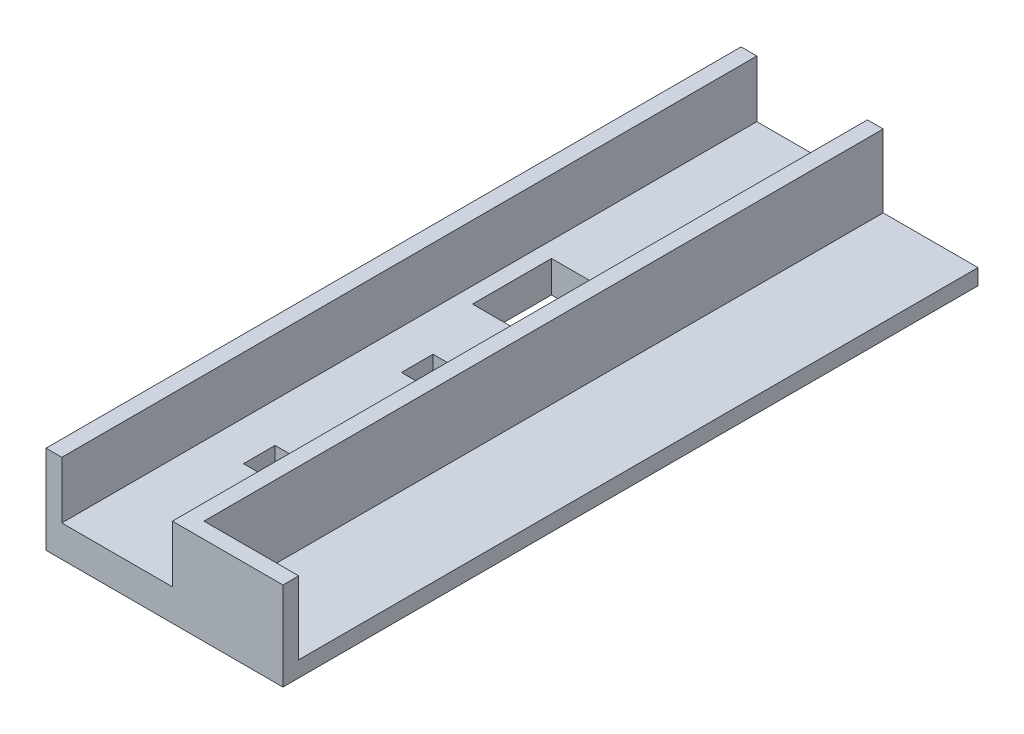
ISO-10303-21;
HEADER;
FILE_DESCRIPTION(('STEP AP214'),'2;1');
FILE_NAME('part.step','',(''),(''),'','','');
FILE_SCHEMA(('AUTOMOTIVE_DESIGN { 1 0 10303 214 1 1 1 1 }'));
ENDSEC;
DATA;
#1=APPLICATION_CONTEXT('core data for automotive mechanical design processes');
#2=APPLICATION_PROTOCOL_DEFINITION('international standard','automotive_design',2000,#1);
#3=PRODUCT_CONTEXT('',#1,'mechanical');
#4=PRODUCT('Part','Part','',(#3));
#5=PRODUCT_RELATED_PRODUCT_CATEGORY('part','',(#4));
#6=PRODUCT_DEFINITION_FORMATION('','',#4);
#7=PRODUCT_DEFINITION_CONTEXT('part definition',#1,'design');
#8=PRODUCT_DEFINITION('design','',#6,#7);
#9=PRODUCT_DEFINITION_SHAPE('','',#8);
#10=(LENGTH_UNIT() NAMED_UNIT(*) SI_UNIT(.MILLI.,.METRE.));
#11=(NAMED_UNIT(*) PLANE_ANGLE_UNIT() SI_UNIT($,.RADIAN.));
#12=(NAMED_UNIT(*) SI_UNIT($,.STERADIAN.) SOLID_ANGLE_UNIT());
#13=UNCERTAINTY_MEASURE_WITH_UNIT(LENGTH_MEASURE(1.E-05),#10,'distance_accuracy_value','');
#14=(GEOMETRIC_REPRESENTATION_CONTEXT(3) GLOBAL_UNCERTAINTY_ASSIGNED_CONTEXT((#13)) GLOBAL_UNIT_ASSIGNED_CONTEXT((#10,
#11,#12)) REPRESENTATION_CONTEXT('',''));
#15=CARTESIAN_POINT('',(0.,0.,0.));
#16=DIRECTION('',(0.,0.,1.));
#17=DIRECTION('',(1.,0.,0.));
#18=AXIS2_PLACEMENT_3D('',#15,#16,#17);
#19=CARTESIAN_POINT('',(0.,-10.,-220.));
#20=DIRECTION('',(0.,-1.,0.));
#21=DIRECTION('',(0.,0.,-1.));
#22=AXIS2_PLACEMENT_3D('',#19,#20,#21);
#23=PLANE('',#22);
#24=DIRECTION('',(0.,0.,-1.));
#25=VECTOR('',#24,1.);
#26=CARTESIAN_POINT('',(-4.99999999999996,-10.,-220.));
#27=LINE('',#26,#25);
#28=CARTESIAN_POINT('',(-4.99999999999999,-10.,-45.));
#29=VERTEX_POINT('',#28);
#30=CARTESIAN_POINT('',(-4.99999999999999,-10.,-55.));
#31=VERTEX_POINT('',#30);
#32=EDGE_CURVE('E287',#29,#31,#27,.T.);
#33=ORIENTED_EDGE('',*,*,#32,.F.);
#34=DIRECTION('',(-1.,0.,0.));
#35=VECTOR('',#34,1.);
#36=CARTESIAN_POINT('',(0.,-10.,-45.));
#37=LINE('',#36,#35);
#38=CARTESIAN_POINT('',(5.00000000000001,-10.,-45.));
#39=VERTEX_POINT('',#38);
#40=EDGE_CURVE('E282',#39,#29,#37,.T.);
#41=ORIENTED_EDGE('',*,*,#40,.F.);
#42=DIRECTION('',(0.,0.,1.));
#43=VECTOR('',#42,1.);
#44=CARTESIAN_POINT('',(5.00000000000004,-10.,-220.));
#45=LINE('',#44,#43);
#46=CARTESIAN_POINT('',(5.00000000000001,-10.,-55.));
#47=VERTEX_POINT('',#46);
#48=EDGE_CURVE('E201',#47,#39,#45,.T.);
#49=ORIENTED_EDGE('',*,*,#48,.F.);
#50=DIRECTION('',(1.,0.,0.));
#51=VECTOR('',#50,1.);
#52=CARTESIAN_POINT('',(0.,-10.,-55.));
#53=LINE('',#52,#51);
#54=EDGE_CURVE('E285',#31,#47,#53,.T.);
#55=ORIENTED_EDGE('',*,*,#54,.F.);
#56=EDGE_LOOP('',(#33,#41,#49,#55));
#57=FACE_BOUND('',#56,.T.);
#58=DIRECTION('',(0.,0.,-1.));
#59=VECTOR('',#58,1.);
#60=CARTESIAN_POINT('',(-5.00000000000002,-10.,-220.));
#61=LINE('',#60,#59);
#62=CARTESIAN_POINT('',(-5.00000000000002,-10.,-95.));
#63=VERTEX_POINT('',#62);
#64=CARTESIAN_POINT('',(-5.00000000000002,-10.,-105.));
#65=VERTEX_POINT('',#64);
#66=EDGE_CURVE('E280',#63,#65,#61,.T.);
#67=ORIENTED_EDGE('',*,*,#66,.F.);
#68=DIRECTION('',(-1.,0.,0.));
#69=VECTOR('',#68,1.);
#70=CARTESIAN_POINT('',(0.,-10.,-95.));
#71=LINE('',#70,#69);
#72=CARTESIAN_POINT('',(4.99999999999998,-10.,-95.));
#73=VERTEX_POINT('',#72);
#74=EDGE_CURVE('E274',#73,#63,#71,.T.);
#75=ORIENTED_EDGE('',*,*,#74,.F.);
#76=DIRECTION('',(0.,0.,1.));
#77=VECTOR('',#76,1.);
#78=CARTESIAN_POINT('',(4.99999999999998,-10.,-220.));
#79=LINE('',#78,#77);
#80=CARTESIAN_POINT('',(4.99999999999998,-10.,-105.));
#81=VERTEX_POINT('',#80);
#82=EDGE_CURVE('E276',#81,#73,#79,.T.);
#83=ORIENTED_EDGE('',*,*,#82,.F.);
#84=DIRECTION('',(1.,0.,0.));
#85=VECTOR('',#84,1.);
#86=CARTESIAN_POINT('',(0.,-10.,-105.));
#87=LINE('',#86,#85);
#88=EDGE_CURVE('E278',#65,#81,#87,.T.);
#89=ORIENTED_EDGE('',*,*,#88,.F.);
#90=EDGE_LOOP('',(#67,#75,#83,#89));
#91=FACE_BOUND('',#90,.T.);
#92=DIRECTION('',(0.,0.,-1.));
#93=VECTOR('',#92,1.);
#94=CARTESIAN_POINT('',(-12.5,-10.,-220.));
#95=LINE('',#94,#93);
#96=CARTESIAN_POINT('',(-12.5,-10.,-125.));
#97=VERTEX_POINT('',#96);
#98=CARTESIAN_POINT('',(-12.5,-10.,-150.));
#99=VERTEX_POINT('',#98);
#100=EDGE_CURVE('E272',#97,#99,#95,.T.);
#101=ORIENTED_EDGE('',*,*,#100,.F.);
#102=DIRECTION('',(-1.,0.,0.));
#103=VECTOR('',#102,1.);
#104=CARTESIAN_POINT('',(0.,-10.,-125.));
#105=LINE('',#104,#103);
#106=CARTESIAN_POINT('',(12.5,-10.,-125.));
#107=VERTEX_POINT('',#106);
#108=EDGE_CURVE('E225',#107,#97,#105,.T.);
#109=ORIENTED_EDGE('',*,*,#108,.F.);
#110=DIRECTION('',(0.,0.,1.));
#111=VECTOR('',#110,1.);
#112=CARTESIAN_POINT('',(12.5,-10.,-220.));
#113=LINE('',#112,#111);
#114=CARTESIAN_POINT('',(12.5,-10.,-150.));
#115=VERTEX_POINT('',#114);
#116=EDGE_CURVE('E267',#115,#107,#113,.T.);
#117=ORIENTED_EDGE('',*,*,#116,.F.);
#118=DIRECTION('',(1.,0.,0.));
#119=VECTOR('',#118,1.);
#120=CARTESIAN_POINT('',(0.,-10.,-150.));
#121=LINE('',#120,#119);
#122=EDGE_CURVE('E270',#99,#115,#121,.T.);
#123=ORIENTED_EDGE('',*,*,#122,.F.);
#124=EDGE_LOOP('',(#101,#109,#117,#123));
#125=FACE_BOUND('',#124,.T.);
#126=DIRECTION('',(1.,0.,0.));
#127=VECTOR('',#126,1.);
#128=CARTESIAN_POINT('',(0.,-10.,0.));
#129=LINE('',#128,#127);
#130=CARTESIAN_POINT('',(-22.5,-10.,0.));
#131=VERTEX_POINT('',#130);
#132=CARTESIAN_POINT('',(52.5,-10.,0.));
#133=VERTEX_POINT('',#132);
#134=EDGE_CURVE('E304',#131,#133,#129,.T.);
#135=ORIENTED_EDGE('',*,*,#134,.F.);
#136=DIRECTION('',(0.,0.,1.));
#137=VECTOR('',#136,1.);
#138=CARTESIAN_POINT('',(-22.5,-10.,-220.));
#139=LINE('',#138,#137);
#140=CARTESIAN_POINT('',(-22.5,-10.,-220.));
#141=VERTEX_POINT('',#140);
#142=EDGE_CURVE('E11',#141,#131,#139,.T.);
#143=ORIENTED_EDGE('',*,*,#142,.F.);
#144=DIRECTION('',(1.,0.,0.));
#145=VECTOR('',#144,1.);
#146=CARTESIAN_POINT('',(0.,-10.,-220.));
#147=LINE('',#146,#145);
#148=CARTESIAN_POINT('',(52.5,-10.,-220.));
#149=VERTEX_POINT('',#148);
#150=EDGE_CURVE('E305',#141,#149,#147,.T.);
#151=ORIENTED_EDGE('',*,*,#150,.T.);
#152=DIRECTION('',(0.,0.,1.));
#153=VECTOR('',#152,1.);
#154=CARTESIAN_POINT('',(52.5,-10.,-220.));
#155=LINE('',#154,#153);
#156=EDGE_CURVE('E44',#149,#133,#155,.T.);
#157=ORIENTED_EDGE('',*,*,#156,.T.);
#158=EDGE_LOOP('',(#135,#143,#151,#157));
#159=FACE_BOUND('',#158,.T.);
#160=ADVANCED_FACE('F41',(#57,#91,#125,#159),#23,.T.);
#161=CARTESIAN_POINT('',(-22.5,0.,-220.));
#162=DIRECTION('',(-1.,0.,0.));
#163=DIRECTION('',(0.,-1.,0.));
#164=AXIS2_PLACEMENT_3D('',#161,#162,#163);
#165=PLANE('',#164);
#166=DIRECTION('',(0.,-1.,0.));
#167=VECTOR('',#166,1.);
#168=CARTESIAN_POINT('',(-22.5,0.,0.));
#169=LINE('',#168,#167);
#170=CARTESIAN_POINT('',(-22.5,18.,0.));
#171=VERTEX_POINT('',#170);
#172=EDGE_CURVE('E309',#171,#131,#169,.T.);
#173=ORIENTED_EDGE('',*,*,#172,.F.);
#174=DIRECTION('',(0.,0.,1.));
#175=VECTOR('',#174,1.);
#176=CARTESIAN_POINT('',(-22.5,18.,-220.));
#177=LINE('',#176,#175);
#178=CARTESIAN_POINT('',(-22.5,18.,-220.));
#179=VERTEX_POINT('',#178);
#180=EDGE_CURVE('E49',#179,#171,#177,.T.);
#181=ORIENTED_EDGE('',*,*,#180,.F.);
#182=DIRECTION('',(0.,-1.,0.));
#183=VECTOR('',#182,1.);
#184=CARTESIAN_POINT('',(-22.5,0.,-220.));
#185=LINE('',#184,#183);
#186=EDGE_CURVE('E331',#179,#141,#185,.T.);
#187=ORIENTED_EDGE('',*,*,#186,.T.);
#188=ORIENTED_EDGE('',*,*,#142,.T.);
#189=EDGE_LOOP('',(#173,#181,#187,#188));
#190=FACE_BOUND('',#189,.T.);
#191=ADVANCED_FACE('F385',(#190),#165,.T.);
#192=CARTESIAN_POINT('',(0.,18.,-220.));
#193=DIRECTION('',(0.,1.,0.));
#194=DIRECTION('',(-1.,0.,0.));
#195=AXIS2_PLACEMENT_3D('',#192,#193,#194);
#196=PLANE('',#195);
#197=DIRECTION('',(-1.,0.,0.));
#198=VECTOR('',#197,1.);
#199=CARTESIAN_POINT('',(0.,18.,0.));
#200=LINE('',#199,#198);
#201=CARTESIAN_POINT('',(-17.5,18.,0.));
#202=VERTEX_POINT('',#201);
#203=EDGE_CURVE('E350',#202,#171,#200,.T.);
#204=ORIENTED_EDGE('',*,*,#203,.F.);
#205=DIRECTION('',(0.,0.,1.));
#206=VECTOR('',#205,1.);
#207=CARTESIAN_POINT('',(-17.5,18.,-220.));
#208=LINE('',#207,#206);
#209=CARTESIAN_POINT('',(-17.5,18.,-220.));
#210=VERTEX_POINT('',#209);
#211=EDGE_CURVE('E356',#210,#202,#208,.T.);
#212=ORIENTED_EDGE('',*,*,#211,.F.);
#213=DIRECTION('',(-1.,0.,0.));
#214=VECTOR('',#213,1.);
#215=CARTESIAN_POINT('',(0.,18.,-220.));
#216=LINE('',#215,#214);
#217=EDGE_CURVE('E328',#210,#179,#216,.T.);
#218=ORIENTED_EDGE('',*,*,#217,.T.);
#219=ORIENTED_EDGE('',*,*,#180,.T.);
#220=EDGE_LOOP('',(#204,#212,#218,#219));
#221=FACE_BOUND('',#220,.T.);
#222=ADVANCED_FACE('F413',(#221),#196,.T.);
#223=CARTESIAN_POINT('',(-17.5,0.,-220.));
#224=DIRECTION('',(-1.,0.,0.));
#225=DIRECTION('',(0.,-1.,0.));
#226=AXIS2_PLACEMENT_3D('',#223,#224,#225);
#227=PLANE('',#226);
#228=DIRECTION('',(0.,-1.,0.));
#229=VECTOR('',#228,1.);
#230=CARTESIAN_POINT('',(-17.5,0.,0.));
#231=LINE('',#230,#229);
#232=CARTESIAN_POINT('',(-17.5,0.,0.));
#233=VERTEX_POINT('',#232);
#234=EDGE_CURVE('E347',#202,#233,#231,.T.);
#235=ORIENTED_EDGE('',*,*,#234,.T.);
#236=DIRECTION('',(0.,0.,1.));
#237=VECTOR('',#236,1.);
#238=CARTESIAN_POINT('',(-17.5,0.,-220.));
#239=LINE('',#238,#237);
#240=CARTESIAN_POINT('',(-17.5,0.,-220.));
#241=VERTEX_POINT('',#240);
#242=EDGE_CURVE('E358',#241,#233,#239,.T.);
#243=ORIENTED_EDGE('',*,*,#242,.F.);
#244=DIRECTION('',(0.,-1.,0.));
#245=VECTOR('',#244,1.);
#246=CARTESIAN_POINT('',(-17.5,0.,-220.));
#247=LINE('',#246,#245);
#248=EDGE_CURVE('E326',#210,#241,#247,.T.);
#249=ORIENTED_EDGE('',*,*,#248,.F.);
#250=ORIENTED_EDGE('',*,*,#211,.T.);
#251=EDGE_LOOP('',(#235,#243,#249,#250));
#252=FACE_BOUND('',#251,.T.);
#253=ADVANCED_FACE('F415',(#252),#227,.F.);
#254=CARTESIAN_POINT('',(0.,0.,-220.));
#255=DIRECTION('',(0.,1.,0.));
#256=DIRECTION('',(-1.,0.,0.));
#257=AXIS2_PLACEMENT_3D('',#254,#255,#256);
#258=PLANE('',#257);
#259=DIRECTION('',(0.,0.,1.));
#260=VECTOR('',#259,1.);
#261=CARTESIAN_POINT('',(-4.99999999999999,0.,-45.));
#262=LINE('',#261,#260);
#263=CARTESIAN_POINT('',(-4.99999999999999,0.,-55.));
#264=VERTEX_POINT('',#263);
#265=CARTESIAN_POINT('',(-4.99999999999999,0.,-45.));
#266=VERTEX_POINT('',#265);
#267=EDGE_CURVE('E213',#264,#266,#262,.T.);
#268=ORIENTED_EDGE('',*,*,#267,.F.);
#269=DIRECTION('',(-1.,0.,0.));
#270=VECTOR('',#269,1.);
#271=CARTESIAN_POINT('',(5.00000000000001,0.,-55.));
#272=LINE('',#271,#270);
#273=CARTESIAN_POINT('',(5.00000000000001,0.,-55.));
#274=VERTEX_POINT('',#273);
#275=EDGE_CURVE('E218',#274,#264,#272,.T.);
#276=ORIENTED_EDGE('',*,*,#275,.F.);
#277=DIRECTION('',(0.,0.,-1.));
#278=VECTOR('',#277,1.);
#279=CARTESIAN_POINT('',(5.00000000000001,0.,-45.));
#280=LINE('',#279,#278);
#281=CARTESIAN_POINT('',(5.00000000000001,0.,-45.));
#282=VERTEX_POINT('',#281);
#283=EDGE_CURVE('E198',#282,#274,#280,.T.);
#284=ORIENTED_EDGE('',*,*,#283,.F.);
#285=DIRECTION('',(1.,0.,0.));
#286=VECTOR('',#285,1.);
#287=CARTESIAN_POINT('',(5.00000000000001,0.,-45.));
#288=LINE('',#287,#286);
#289=EDGE_CURVE('E208',#266,#282,#288,.T.);
#290=ORIENTED_EDGE('',*,*,#289,.F.);
#291=EDGE_LOOP('',(#268,#276,#284,#290));
#292=FACE_BOUND('',#291,.T.);
#293=DIRECTION('',(0.,0.,1.));
#294=VECTOR('',#293,1.);
#295=CARTESIAN_POINT('',(-5.00000000000002,0.,-105.));
#296=LINE('',#295,#294);
#297=CARTESIAN_POINT('',(-5.00000000000002,0.,-105.));
#298=VERTEX_POINT('',#297);
#299=CARTESIAN_POINT('',(-5.00000000000002,0.,-95.));
#300=VERTEX_POINT('',#299);
#301=EDGE_CURVE('E245',#298,#300,#296,.T.);
#302=ORIENTED_EDGE('',*,*,#301,.F.);
#303=DIRECTION('',(-1.,0.,0.));
#304=VECTOR('',#303,1.);
#305=CARTESIAN_POINT('',(4.99999999999998,0.,-105.));
#306=LINE('',#305,#304);
#307=CARTESIAN_POINT('',(4.99999999999998,0.,-105.));
#308=VERTEX_POINT('',#307);
#309=EDGE_CURVE('E231',#308,#298,#306,.T.);
#310=ORIENTED_EDGE('',*,*,#309,.F.);
#311=DIRECTION('',(0.,0.,-1.));
#312=VECTOR('',#311,1.);
#313=CARTESIAN_POINT('',(4.99999999999998,0.,-105.));
#314=LINE('',#313,#312);
#315=CARTESIAN_POINT('',(4.99999999999998,0.,-95.));
#316=VERTEX_POINT('',#315);
#317=EDGE_CURVE('E240',#316,#308,#314,.T.);
#318=ORIENTED_EDGE('',*,*,#317,.F.);
#319=DIRECTION('',(1.,0.,0.));
#320=VECTOR('',#319,1.);
#321=CARTESIAN_POINT('',(4.99999999999998,0.,-95.));
#322=LINE('',#321,#320);
#323=EDGE_CURVE('E243',#300,#316,#322,.T.);
#324=ORIENTED_EDGE('',*,*,#323,.F.);
#325=EDGE_LOOP('',(#302,#310,#318,#324));
#326=FACE_BOUND('',#325,.T.);
#327=DIRECTION('',(0.,0.,1.));
#328=VECTOR('',#327,1.);
#329=CARTESIAN_POINT('',(-12.5,0.,-150.));
#330=LINE('',#329,#328);
#331=CARTESIAN_POINT('',(-12.5,0.,-150.));
#332=VERTEX_POINT('',#331);
#333=CARTESIAN_POINT('',(-12.5,0.,-125.));
#334=VERTEX_POINT('',#333);
#335=EDGE_CURVE('E237',#332,#334,#330,.T.);
#336=ORIENTED_EDGE('',*,*,#335,.F.);
#337=DIRECTION('',(-1.,0.,0.));
#338=VECTOR('',#337,1.);
#339=CARTESIAN_POINT('',(12.5,0.,-150.));
#340=LINE('',#339,#338);
#341=CARTESIAN_POINT('',(12.5,0.,-150.));
#342=VERTEX_POINT('',#341);
#343=EDGE_CURVE('E250',#342,#332,#340,.T.);
#344=ORIENTED_EDGE('',*,*,#343,.F.);
#345=DIRECTION('',(0.,0.,-1.));
#346=VECTOR('',#345,1.);
#347=CARTESIAN_POINT('',(12.5,0.,-150.));
#348=LINE('',#347,#346);
#349=CARTESIAN_POINT('',(12.5,0.,-125.));
#350=VERTEX_POINT('',#349);
#351=EDGE_CURVE('E259',#350,#342,#348,.T.);
#352=ORIENTED_EDGE('',*,*,#351,.F.);
#353=DIRECTION('',(1.,0.,0.));
#354=VECTOR('',#353,1.);
#355=CARTESIAN_POINT('',(12.5,0.,-125.));
#356=LINE('',#355,#354);
#357=EDGE_CURVE('E262',#334,#350,#356,.T.);
#358=ORIENTED_EDGE('',*,*,#357,.F.);
#359=EDGE_LOOP('',(#336,#344,#352,#358));
#360=FACE_BOUND('',#359,.T.);
#361=DIRECTION('',(-1.,0.,0.));
#362=VECTOR('',#361,1.);
#363=CARTESIAN_POINT('',(0.,0.,0.));
#364=LINE('',#363,#362);
#365=CARTESIAN_POINT('',(17.5,0.,0.));
#366=VERTEX_POINT('',#365);
#367=EDGE_CURVE('E344',#366,#233,#364,.T.);
#368=ORIENTED_EDGE('',*,*,#367,.F.);
#369=DIRECTION('',(0.,0.,1.));
#370=VECTOR('',#369,1.);
#371=CARTESIAN_POINT('',(17.5,0.,-220.));
#372=LINE('',#371,#370);
#373=CARTESIAN_POINT('',(17.5,0.,-220.));
#374=VERTEX_POINT('',#373);
#375=EDGE_CURVE('E360',#374,#366,#372,.T.);
#376=ORIENTED_EDGE('',*,*,#375,.F.);
#377=DIRECTION('',(-1.,0.,0.));
#378=VECTOR('',#377,1.);
#379=CARTESIAN_POINT('',(0.,0.,-220.));
#380=LINE('',#379,#378);
#381=EDGE_CURVE('E323',#374,#241,#380,.T.);
#382=ORIENTED_EDGE('',*,*,#381,.T.);
#383=ORIENTED_EDGE('',*,*,#242,.T.);
#384=EDGE_LOOP('',(#368,#376,#382,#383));
#385=FACE_BOUND('',#384,.T.);
#386=ADVANCED_FACE('F215',(#292,#326,#360,#385),#258,.T.);
#387=CARTESIAN_POINT('',(17.5,0.,-220.));
#388=DIRECTION('',(-1.,0.,0.));
#389=DIRECTION('',(0.,0.,1.));
#390=AXIS2_PLACEMENT_3D('',#387,#388,#389);
#391=PLANE('',#390);
#392=DIRECTION('',(0.,-1.,0.));
#393=VECTOR('',#392,1.);
#394=CARTESIAN_POINT('',(17.5,0.,0.));
#395=LINE('',#394,#393);
#396=CARTESIAN_POINT('',(17.5,18.,0.));
#397=VERTEX_POINT('',#396);
#398=EDGE_CURVE('E341',#397,#366,#395,.T.);
#399=ORIENTED_EDGE('',*,*,#398,.F.);
#400=DIRECTION('',(0.,0.,1.));
#401=VECTOR('',#400,1.);
#402=CARTESIAN_POINT('',(17.5,18.,-220.));
#403=LINE('',#402,#401);
#404=CARTESIAN_POINT('',(17.5,18.,-220.));
#405=VERTEX_POINT('',#404);
#406=EDGE_CURVE('E362',#405,#397,#403,.T.);
#407=ORIENTED_EDGE('',*,*,#406,.F.);
#408=DIRECTION('',(0.,-1.,0.));
#409=VECTOR('',#408,1.);
#410=CARTESIAN_POINT('',(17.5,0.,-220.));
#411=LINE('',#410,#409);
#412=EDGE_CURVE('E320',#405,#374,#411,.T.);
#413=ORIENTED_EDGE('',*,*,#412,.T.);
#414=ORIENTED_EDGE('',*,*,#375,.T.);
#415=EDGE_LOOP('',(#399,#407,#413,#414));
#416=FACE_BOUND('',#415,.T.);
#417=ADVANCED_FACE('F406',(#416),#391,.T.);
#418=CARTESIAN_POINT('',(0.,18.,-220.));
#419=DIRECTION('',(0.,-1.,0.));
#420=DIRECTION('',(1.,0.,0.));
#421=AXIS2_PLACEMENT_3D('',#418,#419,#420);
#422=PLANE('',#421);
#423=DIRECTION('',(1.,0.,0.));
#424=VECTOR('',#423,1.);
#425=CARTESIAN_POINT('',(0.,18.,0.));
#426=LINE('',#425,#424);
#427=CARTESIAN_POINT('',(52.5,18.,0.));
#428=VERTEX_POINT('',#427);
#429=EDGE_CURVE('E339',#397,#428,#426,.T.);
#430=ORIENTED_EDGE('',*,*,#429,.T.);
#431=DIRECTION('',(0.,0.,1.));
#432=VECTOR('',#431,1.);
#433=CARTESIAN_POINT('',(52.5,18.,-5.));
#434=LINE('',#433,#432);
#435=CARTESIAN_POINT('',(52.5,18.,-5.));
#436=VERTEX_POINT('',#435);
#437=EDGE_CURVE('E301',#436,#428,#434,.T.);
#438=ORIENTED_EDGE('',*,*,#437,.F.);
#439=DIRECTION('',(-1.,0.,0.));
#440=VECTOR('',#439,1.);
#441=CARTESIAN_POINT('',(22.5,18.,-5.));
#442=LINE('',#441,#440);
#443=CARTESIAN_POINT('',(22.5,18.,-5.));
#444=VERTEX_POINT('',#443);
#445=EDGE_CURVE('E298',#436,#444,#442,.T.);
#446=ORIENTED_EDGE('',*,*,#445,.T.);
#447=DIRECTION('',(0.,0.,1.));
#448=VECTOR('',#447,1.);
#449=CARTESIAN_POINT('',(22.5,18.,-220.));
#450=LINE('',#449,#448);
#451=CARTESIAN_POINT('',(22.5,18.,-220.));
#452=VERTEX_POINT('',#451);
#453=EDGE_CURVE('E364',#452,#444,#450,.T.);
#454=ORIENTED_EDGE('',*,*,#453,.F.);
#455=DIRECTION('',(1.,0.,0.));
#456=VECTOR('',#455,1.);
#457=CARTESIAN_POINT('',(0.,18.,-220.));
#458=LINE('',#457,#456);
#459=EDGE_CURVE('E318',#405,#452,#458,.T.);
#460=ORIENTED_EDGE('',*,*,#459,.F.);
#461=ORIENTED_EDGE('',*,*,#406,.T.);
#462=EDGE_LOOP('',(#430,#438,#446,#454,#460,#461));
#463=FACE_BOUND('',#462,.T.);
#464=ADVANCED_FACE('F402',(#463),#422,.F.);
#465=CARTESIAN_POINT('',(22.5,0.,-220.));
#466=DIRECTION('',(1.,0.,0.));
#467=DIRECTION('',(0.,1.,0.));
#468=AXIS2_PLACEMENT_3D('',#465,#466,#467);
#469=PLANE('',#468);
#470=DIRECTION('',(0.,-1.,0.));
#471=VECTOR('',#470,1.);
#472=CARTESIAN_POINT('',(22.5,-5.00000000000001,-5.));
#473=LINE('',#472,#471);
#474=CARTESIAN_POINT('',(22.5,-5.00000000000001,-5.));
#475=VERTEX_POINT('',#474);
#476=EDGE_CURVE('E289',#444,#475,#473,.T.);
#477=ORIENTED_EDGE('',*,*,#476,.T.);
#478=DIRECTION('',(0.,0.,1.));
#479=VECTOR('',#478,1.);
#480=CARTESIAN_POINT('',(22.5,-5.00000000000001,-220.));
#481=LINE('',#480,#479);
#482=CARTESIAN_POINT('',(22.5,-5.00000000000001,-220.));
#483=VERTEX_POINT('',#482);
#484=EDGE_CURVE('E367',#483,#475,#481,.T.);
#485=ORIENTED_EDGE('',*,*,#484,.F.);
#486=DIRECTION('',(0.,1.,0.));
#487=VECTOR('',#486,1.);
#488=CARTESIAN_POINT('',(22.5,0.,-220.));
#489=LINE('',#488,#487);
#490=EDGE_CURVE('E315',#483,#452,#489,.T.);
#491=ORIENTED_EDGE('',*,*,#490,.T.);
#492=ORIENTED_EDGE('',*,*,#453,.T.);
#493=EDGE_LOOP('',(#477,#485,#491,#492));
#494=FACE_BOUND('',#493,.T.);
#495=ADVANCED_FACE('F398',(#494),#469,.T.);
#496=CARTESIAN_POINT('',(0.,-5.00000000000001,-220.));
#497=DIRECTION('',(0.,1.,0.));
#498=DIRECTION('',(-1.,0.,0.));
#499=AXIS2_PLACEMENT_3D('',#496,#497,#498);
#500=PLANE('',#499);
#501=DIRECTION('',(1.,0.,0.));
#502=VECTOR('',#501,1.);
#503=CARTESIAN_POINT('',(22.5,-5.00000000000001,-5.));
#504=LINE('',#503,#502);
#505=CARTESIAN_POINT('',(52.5,-5.00000000000001,-5.));
#506=VERTEX_POINT('',#505);
#507=EDGE_CURVE('E292',#475,#506,#504,.T.);
#508=ORIENTED_EDGE('',*,*,#507,.T.);
#509=DIRECTION('',(0.,0.,1.));
#510=VECTOR('',#509,1.);
#511=CARTESIAN_POINT('',(52.5,-5.00000000000001,-220.));
#512=LINE('',#511,#510);
#513=CARTESIAN_POINT('',(52.5,-5.00000000000001,-220.));
#514=VERTEX_POINT('',#513);
#515=EDGE_CURVE('E369',#514,#506,#512,.T.);
#516=ORIENTED_EDGE('',*,*,#515,.F.);
#517=DIRECTION('',(-1.,0.,0.));
#518=VECTOR('',#517,1.);
#519=CARTESIAN_POINT('',(0.,-5.00000000000001,-220.));
#520=LINE('',#519,#518);
#521=EDGE_CURVE('E312',#514,#483,#520,.T.);
#522=ORIENTED_EDGE('',*,*,#521,.T.);
#523=ORIENTED_EDGE('',*,*,#484,.T.);
#524=EDGE_LOOP('',(#508,#516,#522,#523));
#525=FACE_BOUND('',#524,.T.);
#526=ADVANCED_FACE('F393',(#525),#500,.T.);
#527=CARTESIAN_POINT('',(52.5,0.,-220.));
#528=DIRECTION('',(1.,0.,0.));
#529=DIRECTION('',(0.,1.,0.));
#530=AXIS2_PLACEMENT_3D('',#527,#528,#529);
#531=PLANE('',#530);
#532=DIRECTION('',(0.,1.,0.));
#533=VECTOR('',#532,1.);
#534=CARTESIAN_POINT('',(52.5,0.,0.));
#535=LINE('',#534,#533);
#536=EDGE_CURVE('E336',#133,#428,#535,.T.);
#537=ORIENTED_EDGE('',*,*,#536,.F.);
#538=ORIENTED_EDGE('',*,*,#156,.F.);
#539=DIRECTION('',(0.,1.,0.));
#540=VECTOR('',#539,1.);
#541=CARTESIAN_POINT('',(52.5,0.,-220.));
#542=LINE('',#541,#540);
#543=EDGE_CURVE('E308',#149,#514,#542,.T.);
#544=ORIENTED_EDGE('',*,*,#543,.T.);
#545=ORIENTED_EDGE('',*,*,#515,.T.);
#546=DIRECTION('',(0.,1.,0.));
#547=VECTOR('',#546,1.);
#548=CARTESIAN_POINT('',(52.5,-5.00000000000001,-5.));
#549=LINE('',#548,#547);
#550=EDGE_CURVE('E295',#506,#436,#549,.T.);
#551=ORIENTED_EDGE('',*,*,#550,.T.);
#552=ORIENTED_EDGE('',*,*,#437,.T.);
#553=EDGE_LOOP('',(#537,#538,#544,#545,#551,#552));
#554=FACE_BOUND('',#553,.T.);
#555=ADVANCED_FACE('F377',(#554),#531,.T.);
#556=CARTESIAN_POINT('',(0.,0.,-220.));
#557=DIRECTION('',(0.,0.,1.));
#558=DIRECTION('',(1.,0.,0.));
#559=AXIS2_PLACEMENT_3D('',#556,#557,#558);
#560=PLANE('',#559);
#561=ORIENTED_EDGE('',*,*,#150,.F.);
#562=ORIENTED_EDGE('',*,*,#186,.F.);
#563=ORIENTED_EDGE('',*,*,#217,.F.);
#564=ORIENTED_EDGE('',*,*,#248,.T.);
#565=ORIENTED_EDGE('',*,*,#381,.F.);
#566=ORIENTED_EDGE('',*,*,#412,.F.);
#567=ORIENTED_EDGE('',*,*,#459,.T.);
#568=ORIENTED_EDGE('',*,*,#490,.F.);
#569=ORIENTED_EDGE('',*,*,#521,.F.);
#570=ORIENTED_EDGE('',*,*,#543,.F.);
#571=EDGE_LOOP('',(#561,#562,#563,#564,#565,#566,#567,#568,#569,#570));
#572=FACE_BOUND('',#571,.T.);
#573=ADVANCED_FACE('F388',(#572),#560,.F.);
#574=CARTESIAN_POINT('',(0.,0.,0.));
#575=DIRECTION('',(0.,0.,1.));
#576=DIRECTION('',(1.,0.,0.));
#577=AXIS2_PLACEMENT_3D('',#574,#575,#576);
#578=PLANE('',#577);
#579=ORIENTED_EDGE('',*,*,#536,.T.);
#580=ORIENTED_EDGE('',*,*,#429,.F.);
#581=ORIENTED_EDGE('',*,*,#398,.T.);
#582=ORIENTED_EDGE('',*,*,#367,.T.);
#583=ORIENTED_EDGE('',*,*,#234,.F.);
#584=ORIENTED_EDGE('',*,*,#203,.T.);
#585=ORIENTED_EDGE('',*,*,#172,.T.);
#586=ORIENTED_EDGE('',*,*,#134,.T.);
#587=EDGE_LOOP('',(#579,#580,#581,#582,#583,#584,#585,#586));
#588=FACE_BOUND('',#587,.T.);
#589=ADVANCED_FACE('F380',(#588),#578,.T.);
#590=CARTESIAN_POINT('',(0.,0.,-5.));
#591=DIRECTION('',(0.,0.,-1.));
#592=DIRECTION('',(-1.,0.,0.));
#593=AXIS2_PLACEMENT_3D('',#590,#591,#592);
#594=PLANE('',#593);
#595=ORIENTED_EDGE('',*,*,#476,.F.);
#596=ORIENTED_EDGE('',*,*,#445,.F.);
#597=ORIENTED_EDGE('',*,*,#550,.F.);
#598=ORIENTED_EDGE('',*,*,#507,.F.);
#599=EDGE_LOOP('',(#595,#596,#597,#598));
#600=FACE_BOUND('',#599,.T.);
#601=ADVANCED_FACE('F395',(#600),#594,.T.);
#602=CARTESIAN_POINT('',(-12.5,-25.,-150.));
#603=DIRECTION('',(-1.,0.,0.));
#604=DIRECTION('',(0.,-1.,0.));
#605=AXIS2_PLACEMENT_3D('',#602,#603,#604);
#606=PLANE('',#605);
#607=ORIENTED_EDGE('',*,*,#100,.T.);
#608=DIRECTION('',(0.,1.,0.));
#609=VECTOR('',#608,1.);
#610=CARTESIAN_POINT('',(-12.5,-25.,-150.));
#611=LINE('',#610,#609);
#612=EDGE_CURVE('E255',#99,#332,#611,.T.);
#613=ORIENTED_EDGE('',*,*,#612,.T.);
#614=ORIENTED_EDGE('',*,*,#335,.T.);
#615=DIRECTION('',(0.,1.,0.));
#616=VECTOR('',#615,1.);
#617=CARTESIAN_POINT('',(-12.5,-25.,-125.));
#618=LINE('',#617,#616);
#619=EDGE_CURVE('E247',#97,#334,#618,.T.);
#620=ORIENTED_EDGE('',*,*,#619,.F.);
#621=EDGE_LOOP('',(#607,#613,#614,#620));
#622=FACE_BOUND('',#621,.T.);
#623=ADVANCED_FACE('F446',(#622),#606,.F.);
#624=CARTESIAN_POINT('',(12.5,-25.,-150.));
#625=DIRECTION('',(0.,0.,-1.));
#626=DIRECTION('',(-1.,0.,0.));
#627=AXIS2_PLACEMENT_3D('',#624,#625,#626);
#628=PLANE('',#627);
#629=ORIENTED_EDGE('',*,*,#122,.T.);
#630=DIRECTION('',(0.,1.,0.));
#631=VECTOR('',#630,1.);
#632=CARTESIAN_POINT('',(12.5,-25.,-150.));
#633=LINE('',#632,#631);
#634=EDGE_CURVE('E253',#115,#342,#633,.T.);
#635=ORIENTED_EDGE('',*,*,#634,.T.);
#636=ORIENTED_EDGE('',*,*,#343,.T.);
#637=ORIENTED_EDGE('',*,*,#612,.F.);
#638=EDGE_LOOP('',(#629,#635,#636,#637));
#639=FACE_BOUND('',#638,.T.);
#640=ADVANCED_FACE('F448',(#639),#628,.F.);
#641=CARTESIAN_POINT('',(12.5,-25.,-150.));
#642=DIRECTION('',(1.,0.,0.));
#643=DIRECTION('',(0.,0.,-1.));
#644=AXIS2_PLACEMENT_3D('',#641,#642,#643);
#645=PLANE('',#644);
#646=ORIENTED_EDGE('',*,*,#116,.T.);
#647=DIRECTION('',(0.,1.,0.));
#648=VECTOR('',#647,1.);
#649=CARTESIAN_POINT('',(12.5,-25.,-125.));
#650=LINE('',#649,#648);
#651=EDGE_CURVE('E251',#107,#350,#650,.T.);
#652=ORIENTED_EDGE('',*,*,#651,.T.);
#653=ORIENTED_EDGE('',*,*,#351,.T.);
#654=ORIENTED_EDGE('',*,*,#634,.F.);
#655=EDGE_LOOP('',(#646,#652,#653,#654));
#656=FACE_BOUND('',#655,.T.);
#657=ADVANCED_FACE('F458',(#656),#645,.F.);
#658=CARTESIAN_POINT('',(12.5,-25.,-125.));
#659=DIRECTION('',(0.,0.,1.));
#660=DIRECTION('',(1.,0.,0.));
#661=AXIS2_PLACEMENT_3D('',#658,#659,#660);
#662=PLANE('',#661);
#663=ORIENTED_EDGE('',*,*,#108,.T.);
#664=ORIENTED_EDGE('',*,*,#619,.T.);
#665=ORIENTED_EDGE('',*,*,#357,.T.);
#666=ORIENTED_EDGE('',*,*,#651,.F.);
#667=EDGE_LOOP('',(#663,#664,#665,#666));
#668=FACE_BOUND('',#667,.T.);
#669=ADVANCED_FACE('F456',(#668),#662,.F.);
#670=CARTESIAN_POINT('',(-5.00000000000002,-25.,-105.));
#671=DIRECTION('',(-1.,0.,0.));
#672=DIRECTION('',(0.,-1.,0.));
#673=AXIS2_PLACEMENT_3D('',#670,#671,#672);
#674=PLANE('',#673);
#675=ORIENTED_EDGE('',*,*,#66,.T.);
#676=DIRECTION('',(0.,1.,0.));
#677=VECTOR('',#676,1.);
#678=CARTESIAN_POINT('',(-5.00000000000002,-25.,-105.));
#679=LINE('',#678,#677);
#680=EDGE_CURVE('E235',#65,#298,#679,.T.);
#681=ORIENTED_EDGE('',*,*,#680,.T.);
#682=ORIENTED_EDGE('',*,*,#301,.T.);
#683=DIRECTION('',(0.,1.,0.));
#684=VECTOR('',#683,1.);
#685=CARTESIAN_POINT('',(-5.00000000000002,-25.,-95.));
#686=LINE('',#685,#684);
#687=EDGE_CURVE('E228',#63,#300,#686,.T.);
#688=ORIENTED_EDGE('',*,*,#687,.F.);
#689=EDGE_LOOP('',(#675,#681,#682,#688));
#690=FACE_BOUND('',#689,.T.);
#691=ADVANCED_FACE('F465',(#690),#674,.F.);
#692=CARTESIAN_POINT('',(4.99999999999998,-25.,-105.));
#693=DIRECTION('',(0.,0.,-1.));
#694=DIRECTION('',(-1.,0.,0.));
#695=AXIS2_PLACEMENT_3D('',#692,#693,#694);
#696=PLANE('',#695);
#697=ORIENTED_EDGE('',*,*,#88,.T.);
#698=DIRECTION('',(0.,1.,0.));
#699=VECTOR('',#698,1.);
#700=CARTESIAN_POINT('',(4.99999999999998,-25.,-105.));
#701=LINE('',#700,#699);
#702=EDGE_CURVE('E233',#81,#308,#701,.T.);
#703=ORIENTED_EDGE('',*,*,#702,.T.);
#704=ORIENTED_EDGE('',*,*,#309,.T.);
#705=ORIENTED_EDGE('',*,*,#680,.F.);
#706=EDGE_LOOP('',(#697,#703,#704,#705));
#707=FACE_BOUND('',#706,.T.);
#708=ADVANCED_FACE('F519',(#707),#696,.F.);
#709=CARTESIAN_POINT('',(4.99999999999998,-25.,-105.));
#710=DIRECTION('',(1.,0.,0.));
#711=DIRECTION('',(0.,1.,0.));
#712=AXIS2_PLACEMENT_3D('',#709,#710,#711);
#713=PLANE('',#712);
#714=ORIENTED_EDGE('',*,*,#82,.T.);
#715=DIRECTION('',(0.,1.,0.));
#716=VECTOR('',#715,1.);
#717=CARTESIAN_POINT('',(4.99999999999998,-25.,-95.));
#718=LINE('',#717,#716);
#719=EDGE_CURVE('E65',#73,#316,#718,.T.);
#720=ORIENTED_EDGE('',*,*,#719,.T.);
#721=ORIENTED_EDGE('',*,*,#317,.T.);
#722=ORIENTED_EDGE('',*,*,#702,.F.);
#723=EDGE_LOOP('',(#714,#720,#721,#722));
#724=FACE_BOUND('',#723,.T.);
#725=ADVANCED_FACE('F529',(#724),#713,.F.);
#726=CARTESIAN_POINT('',(4.99999999999998,-25.,-95.));
#727=DIRECTION('',(0.,0.,1.));
#728=DIRECTION('',(1.,0.,0.));
#729=AXIS2_PLACEMENT_3D('',#726,#727,#728);
#730=PLANE('',#729);
#731=ORIENTED_EDGE('',*,*,#74,.T.);
#732=ORIENTED_EDGE('',*,*,#687,.T.);
#733=ORIENTED_EDGE('',*,*,#323,.T.);
#734=ORIENTED_EDGE('',*,*,#719,.F.);
#735=EDGE_LOOP('',(#731,#732,#733,#734));
#736=FACE_BOUND('',#735,.T.);
#737=ADVANCED_FACE('F539',(#736),#730,.F.);
#738=CARTESIAN_POINT('',(-4.99999999999999,-25.,-45.));
#739=DIRECTION('',(-1.,0.,0.));
#740=DIRECTION('',(0.,0.,1.));
#741=AXIS2_PLACEMENT_3D('',#738,#739,#740);
#742=PLANE('',#741);
#743=ORIENTED_EDGE('',*,*,#32,.T.);
#744=DIRECTION('',(0.,1.,0.));
#745=VECTOR('',#744,1.);
#746=CARTESIAN_POINT('',(-4.99999999999999,-25.,-55.));
#747=LINE('',#746,#745);
#748=EDGE_CURVE('E223',#31,#264,#747,.T.);
#749=ORIENTED_EDGE('',*,*,#748,.T.);
#750=ORIENTED_EDGE('',*,*,#267,.T.);
#751=DIRECTION('',(0.,1.,0.));
#752=VECTOR('',#751,1.);
#753=CARTESIAN_POINT('',(-4.99999999999999,-25.,-45.));
#754=LINE('',#753,#752);
#755=EDGE_CURVE('E204',#29,#266,#754,.T.);
#756=ORIENTED_EDGE('',*,*,#755,.F.);
#757=EDGE_LOOP('',(#743,#749,#750,#756));
#758=FACE_BOUND('',#757,.T.);
#759=ADVANCED_FACE('F549',(#758),#742,.F.);
#760=CARTESIAN_POINT('',(5.00000000000001,-25.,-55.));
#761=DIRECTION('',(0.,0.,-1.));
#762=DIRECTION('',(-1.,0.,0.));
#763=AXIS2_PLACEMENT_3D('',#760,#761,#762);
#764=PLANE('',#763);
#765=ORIENTED_EDGE('',*,*,#54,.T.);
#766=DIRECTION('',(0.,1.,0.));
#767=VECTOR('',#766,1.);
#768=CARTESIAN_POINT('',(5.00000000000001,-25.,-55.));
#769=LINE('',#768,#767);
#770=EDGE_CURVE('E203',#47,#274,#769,.T.);
#771=ORIENTED_EDGE('',*,*,#770,.T.);
#772=ORIENTED_EDGE('',*,*,#275,.T.);
#773=ORIENTED_EDGE('',*,*,#748,.F.);
#774=EDGE_LOOP('',(#765,#771,#772,#773));
#775=FACE_BOUND('',#774,.T.);
#776=ADVANCED_FACE('F558',(#775),#764,.F.);
#777=CARTESIAN_POINT('',(5.00000000000001,-25.,-45.));
#778=DIRECTION('',(1.,0.,0.));
#779=DIRECTION('',(0.,0.,-1.));
#780=AXIS2_PLACEMENT_3D('',#777,#778,#779);
#781=PLANE('',#780);
#782=ORIENTED_EDGE('',*,*,#48,.T.);
#783=DIRECTION('',(0.,1.,0.));
#784=VECTOR('',#783,1.);
#785=CARTESIAN_POINT('',(5.00000000000001,-25.,-45.));
#786=LINE('',#785,#784);
#787=EDGE_CURVE('E57',#39,#282,#786,.T.);
#788=ORIENTED_EDGE('',*,*,#787,.T.);
#789=ORIENTED_EDGE('',*,*,#283,.T.);
#790=ORIENTED_EDGE('',*,*,#770,.F.);
#791=EDGE_LOOP('',(#782,#788,#789,#790));
#792=FACE_BOUND('',#791,.T.);
#793=ADVANCED_FACE('F195',(#792),#781,.F.);
#794=CARTESIAN_POINT('',(5.00000000000001,-25.,-45.));
#795=DIRECTION('',(0.,0.,1.));
#796=DIRECTION('',(1.,0.,0.));
#797=AXIS2_PLACEMENT_3D('',#794,#795,#796);
#798=PLANE('',#797);
#799=ORIENTED_EDGE('',*,*,#40,.T.);
#800=ORIENTED_EDGE('',*,*,#755,.T.);
#801=ORIENTED_EDGE('',*,*,#289,.T.);
#802=ORIENTED_EDGE('',*,*,#787,.F.);
#803=EDGE_LOOP('',(#799,#800,#801,#802));
#804=FACE_BOUND('',#803,.T.);
#805=ADVANCED_FACE('F209',(#804),#798,.F.);
#806=CLOSED_SHELL('',(#160,#191,#222,#253,#386,#417,#464,#495,#526,#555,#573,#589,#601,#623,
#640,#657,#669,#691,#708,#725,#737,#759,#776,#793,#805));
#807=MANIFOLD_SOLID_BREP('B2',#806);
#808=ADVANCED_BREP_SHAPE_REPRESENTATION('',(#18,#807),#14);
#809=SHAPE_DEFINITION_REPRESENTATION(#9,#808);
ENDSEC;
END-ISO-10303-21;
